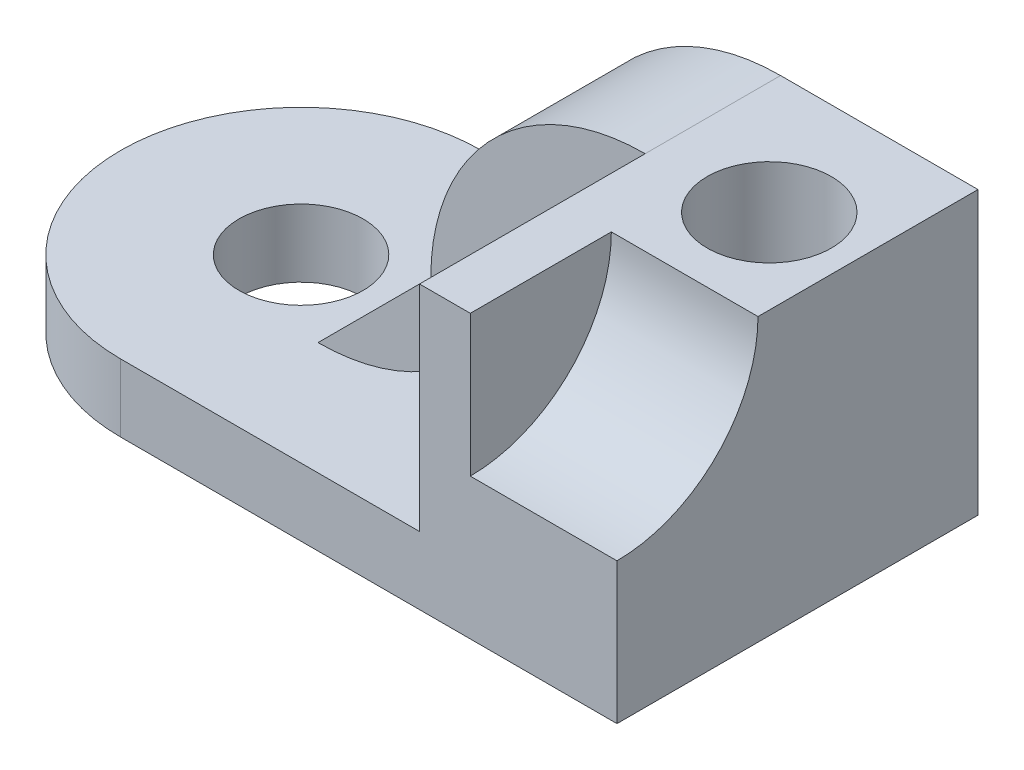
ISO-10303-21;
HEADER;
FILE_DESCRIPTION(('STEP AP214'),'2;1');
FILE_NAME('part.step','',(''),(''),'','','');
FILE_SCHEMA(('AUTOMOTIVE_DESIGN { 1 0 10303 214 1 1 1 1 }'));
ENDSEC;
DATA;
#1=APPLICATION_CONTEXT('core data for automotive mechanical design processes');
#2=APPLICATION_PROTOCOL_DEFINITION('international standard','automotive_design',2000,#1);
#3=PRODUCT_CONTEXT('',#1,'mechanical');
#4=PRODUCT('Part','Part','',(#3));
#5=PRODUCT_RELATED_PRODUCT_CATEGORY('part','',(#4));
#6=PRODUCT_DEFINITION_FORMATION('','',#4);
#7=PRODUCT_DEFINITION_CONTEXT('part definition',#1,'design');
#8=PRODUCT_DEFINITION('design','',#6,#7);
#9=PRODUCT_DEFINITION_SHAPE('','',#8);
#10=(LENGTH_UNIT() NAMED_UNIT(*) SI_UNIT(.MILLI.,.METRE.));
#11=(NAMED_UNIT(*) PLANE_ANGLE_UNIT() SI_UNIT($,.RADIAN.));
#12=(NAMED_UNIT(*) SI_UNIT($,.STERADIAN.) SOLID_ANGLE_UNIT());
#13=UNCERTAINTY_MEASURE_WITH_UNIT(LENGTH_MEASURE(1.E-05),#10,'distance_accuracy_value','');
#14=(GEOMETRIC_REPRESENTATION_CONTEXT(3) GLOBAL_UNCERTAINTY_ASSIGNED_CONTEXT((#13)) GLOBAL_UNIT_ASSIGNED_CONTEXT((#10,
#11,#12)) REPRESENTATION_CONTEXT('',''));
#15=CARTESIAN_POINT('',(0.,0.,0.));
#16=DIRECTION('',(0.,0.,1.));
#17=DIRECTION('',(1.,0.,0.));
#18=AXIS2_PLACEMENT_3D('',#15,#16,#17);
#19=CARTESIAN_POINT('',(47.,50.,12.));
#20=DIRECTION('',(0.,0.,-1.));
#21=DIRECTION('',(-1.,0.,0.));
#22=AXIS2_PLACEMENT_3D('',#19,#20,#21);
#23=CYLINDRICAL_SURFACE('',#22,38.);
#24=CARTESIAN_POINT('',(47.,50.,-32.));
#25=DIRECTION('',(0.,0.,1.));
#26=DIRECTION('',(1.,0.,0.));
#27=AXIS2_PLACEMENT_3D('',#24,#25,#26);
#28=CIRCLE('',#27,38.);
#29=CARTESIAN_POINT('',(47.,12.,-32.));
#30=VERTEX_POINT('',#29);
#31=CARTESIAN_POINT('',(85.,50.,-32.));
#32=VERTEX_POINT('',#31);
#33=EDGE_CURVE('E74',#30,#32,#28,.T.);
#34=ORIENTED_EDGE('',*,*,#33,.T.);
#35=DIRECTION('',(0.,0.,-1.));
#36=VECTOR('',#35,1.);
#37=CARTESIAN_POINT('',(85.,50.,12.));
#38=LINE('',#37,#36);
#39=CARTESIAN_POINT('',(85.,50.,12.));
#40=VERTEX_POINT('',#39);
#41=EDGE_CURVE('E12',#40,#32,#38,.T.);
#42=ORIENTED_EDGE('',*,*,#41,.F.);
#43=CARTESIAN_POINT('',(47.,50.,12.));
#44=DIRECTION('',(0.,0.,1.));
#45=DIRECTION('',(1.,0.,0.));
#46=AXIS2_PLACEMENT_3D('',#43,#44,#45);
#47=CIRCLE('',#46,38.);
#48=CARTESIAN_POINT('',(47.,12.,12.));
#49=VERTEX_POINT('',#48);
#50=EDGE_CURVE('E76',#49,#40,#47,.T.);
#51=ORIENTED_EDGE('',*,*,#50,.F.);
#52=DIRECTION('',(0.,0.,-1.));
#53=VECTOR('',#52,1.);
#54=CARTESIAN_POINT('',(47.,12.,12.));
#55=LINE('',#54,#53);
#56=EDGE_CURVE('E58',#49,#30,#55,.T.);
#57=ORIENTED_EDGE('',*,*,#56,.T.);
#58=EDGE_LOOP('',(#34,#42,#51,#57));
#59=FACE_BOUND('',#58,.T.);
#60=ADVANCED_FACE('F49',(#59),#23,.T.);
#61=CARTESIAN_POINT('',(17.5,-17.5,12.));
#62=DIRECTION('',(-0.707106781186548,0.707106781186548,0.));
#63=DIRECTION('',(-0.707106781186548,-0.707106781186548,0.));
#64=AXIS2_PLACEMENT_3D('',#61,#62,#63);
#65=PLANE('',#64);
#66=DIRECTION('',(0.707106781186548,0.707106781186548,0.));
#67=VECTOR('',#66,1.);
#68=CARTESIAN_POINT('',(17.5,-17.5,-32.));
#69=LINE('',#68,#67);
#70=EDGE_CURVE('E82',#30,#32,#69,.T.);
#71=ORIENTED_EDGE('',*,*,#70,.F.);
#72=ORIENTED_EDGE('',*,*,#56,.F.);
#73=DIRECTION('',(0.707106781186548,0.707106781186548,0.));
#74=VECTOR('',#73,1.);
#75=CARTESIAN_POINT('',(17.5,-17.5,12.));
#76=LINE('',#75,#74);
#77=EDGE_CURVE('E79',#49,#40,#76,.T.);
#78=ORIENTED_EDGE('',*,*,#77,.T.);
#79=ORIENTED_EDGE('',*,*,#41,.T.);
#80=EDGE_LOOP('',(#71,#72,#78,#79));
#81=FACE_BOUND('',#80,.T.);
#82=ADVANCED_FACE('F85',(#81),#65,.T.);
#83=CARTESIAN_POINT('',(47.,50.,12.));
#84=DIRECTION('',(0.,0.,1.));
#85=DIRECTION('',(1.,0.,0.));
#86=AXIS2_PLACEMENT_3D('',#83,#84,#85);
#87=PLANE('',#86);
#88=ORIENTED_EDGE('',*,*,#50,.T.);
#89=ORIENTED_EDGE('',*,*,#77,.F.);
#90=EDGE_LOOP('',(#88,#89));
#91=FACE_BOUND('',#90,.T.);
#92=ADVANCED_FACE('F95',(#91),#87,.T.);
#93=CARTESIAN_POINT('',(47.,50.,-32.));
#94=DIRECTION('',(0.,0.,1.));
#95=DIRECTION('',(1.,0.,0.));
#96=AXIS2_PLACEMENT_3D('',#93,#94,#95);
#97=PLANE('',#96);
#98=ORIENTED_EDGE('',*,*,#33,.F.);
#99=ORIENTED_EDGE('',*,*,#70,.T.);
#100=EDGE_LOOP('',(#98,#99));
#101=FACE_BOUND('',#100,.T.);
#102=ADVANCED_FACE('F81',(#101),#97,.F.);
#103=CLOSED_SHELL('',(#60,#82,#92,#102));
#104=MANIFOLD_SOLID_BREP('B2',#103);
#105=CARTESIAN_POINT('',(85.,12.,-8.));
#106=DIRECTION('',(0.,0.,-1.));
#107=DIRECTION('',(-1.,0.,0.));
#108=AXIS2_PLACEMENT_3D('',#105,#106,#107);
#109=CYLINDRICAL_SURFACE('',#108,38.);
#110=CARTESIAN_POINT('',(85.,12.,-32.));
#111=DIRECTION('',(0.,0.,1.));
#112=DIRECTION('',(1.,0.,0.));
#113=AXIS2_PLACEMENT_3D('',#110,#111,#112);
#114=CIRCLE('',#113,38.);
#115=CARTESIAN_POINT('',(85.,50.,-32.));
#116=VERTEX_POINT('',#115);
#117=CARTESIAN_POINT('',(47.,12.,-32.));
#118=VERTEX_POINT('',#117);
#119=EDGE_CURVE('E182',#116,#118,#114,.T.);
#120=ORIENTED_EDGE('',*,*,#119,.T.);
#121=DIRECTION('',(0.,0.,-1.));
#122=VECTOR('',#121,1.);
#123=CARTESIAN_POINT('',(47.,12.,-8.));
#124=LINE('',#123,#122);
#125=CARTESIAN_POINT('',(47.,12.,-8.));
#126=VERTEX_POINT('',#125);
#127=EDGE_CURVE('E47',#126,#118,#124,.T.);
#128=ORIENTED_EDGE('',*,*,#127,.F.);
#129=CARTESIAN_POINT('',(85.,12.,-8.));
#130=DIRECTION('',(0.,0.,1.));
#131=DIRECTION('',(1.,0.,0.));
#132=AXIS2_PLACEMENT_3D('',#129,#130,#131);
#133=CIRCLE('',#132,38.);
#134=CARTESIAN_POINT('',(85.,50.,-8.));
#135=VERTEX_POINT('',#134);
#136=EDGE_CURVE('E181',#135,#126,#133,.T.);
#137=ORIENTED_EDGE('',*,*,#136,.F.);
#138=DIRECTION('',(0.,0.,-1.));
#139=VECTOR('',#138,1.);
#140=CARTESIAN_POINT('',(85.,50.,-8.));
#141=LINE('',#140,#139);
#142=EDGE_CURVE('E158',#135,#116,#141,.T.);
#143=ORIENTED_EDGE('',*,*,#142,.T.);
#144=EDGE_LOOP('',(#120,#128,#137,#143));
#145=FACE_BOUND('',#144,.T.);
#146=ADVANCED_FACE('F149',(#145),#109,.T.);
#147=CARTESIAN_POINT('',(17.5,-17.5,-8.));
#148=DIRECTION('',(-0.707106781186547,0.707106781186547,0.));
#149=DIRECTION('',(-0.707106781186548,-0.707106781186548,0.));
#150=AXIS2_PLACEMENT_3D('',#147,#148,#149);
#151=PLANE('',#150);
#152=DIRECTION('',(0.707106781186548,0.707106781186548,0.));
#153=VECTOR('',#152,1.);
#154=CARTESIAN_POINT('',(17.5,-17.5,-32.));
#155=LINE('',#154,#153);
#156=EDGE_CURVE('E173',#118,#116,#155,.T.);
#157=ORIENTED_EDGE('',*,*,#156,.T.);
#158=ORIENTED_EDGE('',*,*,#142,.F.);
#159=DIRECTION('',(0.707106781186548,0.707106781186548,0.));
#160=VECTOR('',#159,1.);
#161=CARTESIAN_POINT('',(17.5,-17.5,-8.));
#162=LINE('',#161,#160);
#163=EDGE_CURVE('E165',#126,#135,#162,.T.);
#164=ORIENTED_EDGE('',*,*,#163,.F.);
#165=ORIENTED_EDGE('',*,*,#127,.T.);
#166=EDGE_LOOP('',(#157,#158,#164,#165));
#167=FACE_BOUND('',#166,.T.);
#168=ADVANCED_FACE('F176',(#167),#151,.F.);
#169=CARTESIAN_POINT('',(85.,12.,-8.));
#170=DIRECTION('',(0.,0.,1.));
#171=DIRECTION('',(1.,0.,0.));
#172=AXIS2_PLACEMENT_3D('',#169,#170,#171);
#173=PLANE('',#172);
#174=ORIENTED_EDGE('',*,*,#136,.T.);
#175=ORIENTED_EDGE('',*,*,#163,.T.);
#176=EDGE_LOOP('',(#174,#175));
#177=FACE_BOUND('',#176,.T.);
#178=ADVANCED_FACE('F195',(#177),#173,.T.);
#179=CARTESIAN_POINT('',(85.,12.,-32.));
#180=DIRECTION('',(0.,0.,1.));
#181=DIRECTION('',(1.,0.,0.));
#182=AXIS2_PLACEMENT_3D('',#179,#180,#181);
#183=PLANE('',#182);
#184=ORIENTED_EDGE('',*,*,#119,.F.);
#185=ORIENTED_EDGE('',*,*,#156,.F.);
#186=EDGE_LOOP('',(#184,#185));
#187=FACE_BOUND('',#186,.T.);
#188=ADVANCED_FACE('F186',(#187),#183,.F.);
#189=CLOSED_SHELL('',(#146,#168,#178,#188));
#190=MANIFOLD_SOLID_BREP('B6',#189);
#191=CARTESIAN_POINT('',(120.,0.,32.));
#192=DIRECTION('',(-1.,0.,0.));
#193=DIRECTION('',(0.,0.,1.));
#194=AXIS2_PLACEMENT_3D('',#191,#192,#193);
#195=PLANE('',#194);
#196=DIRECTION('',(0.,0.,-1.));
#197=VECTOR('',#196,1.);
#198=CARTESIAN_POINT('',(120.,50.,32.));
#199=LINE('',#198,#197);
#200=CARTESIAN_POINT('',(120.,50.,7.));
#201=VERTEX_POINT('',#200);
#202=CARTESIAN_POINT('',(120.,50.,-32.));
#203=VERTEX_POINT('',#202);
#204=EDGE_CURVE('E328',#201,#203,#199,.T.);
#205=ORIENTED_EDGE('',*,*,#204,.F.);
#206=CARTESIAN_POINT('',(120.,50.,32.));
#207=DIRECTION('',(1.,0.,0.));
#208=DIRECTION('',(0.,0.,-1.));
#209=AXIS2_PLACEMENT_3D('',#206,#207,#208);
#210=CIRCLE('',#209,25.);
#211=CARTESIAN_POINT('',(120.,25.,32.));
#212=VERTEX_POINT('',#211);
#213=EDGE_CURVE('E308',#212,#201,#210,.T.);
#214=ORIENTED_EDGE('',*,*,#213,.F.);
#215=DIRECTION('',(0.,1.,0.));
#216=VECTOR('',#215,1.);
#217=CARTESIAN_POINT('',(120.,0.,32.));
#218=LINE('',#217,#216);
#219=CARTESIAN_POINT('',(120.,0.,32.));
#220=VERTEX_POINT('',#219);
#221=EDGE_CURVE('E410',#220,#212,#218,.T.);
#222=ORIENTED_EDGE('',*,*,#221,.F.);
#223=DIRECTION('',(0.,0.,-1.));
#224=VECTOR('',#223,1.);
#225=CARTESIAN_POINT('',(120.,0.,32.));
#226=LINE('',#225,#224);
#227=CARTESIAN_POINT('',(120.,0.,-32.));
#228=VERTEX_POINT('',#227);
#229=EDGE_CURVE('E385',#220,#228,#226,.T.);
#230=ORIENTED_EDGE('',*,*,#229,.T.);
#231=DIRECTION('',(0.,1.,0.));
#232=VECTOR('',#231,1.);
#233=CARTESIAN_POINT('',(120.,0.,-32.));
#234=LINE('',#233,#232);
#235=EDGE_CURVE('E333',#228,#203,#234,.T.);
#236=ORIENTED_EDGE('',*,*,#235,.T.);
#237=EDGE_LOOP('',(#205,#214,#222,#230,#236));
#238=FACE_BOUND('',#237,.T.);
#239=ADVANCED_FACE('F240',(#238),#195,.F.);
#240=CARTESIAN_POINT('',(0.,50.,32.));
#241=DIRECTION('',(0.,-1.,0.));
#242=DIRECTION('',(1.,0.,0.));
#243=AXIS2_PLACEMENT_3D('',#240,#241,#242);
#244=PLANE('',#243);
#245=CARTESIAN_POINT('',(105.,50.,-10.));
#246=DIRECTION('',(0.,1.,0.));
#247=DIRECTION('',(-1.,0.,0.));
#248=AXIS2_PLACEMENT_3D('',#245,#246,#247);
#249=CIRCLE('',#248,11.);
#250=CARTESIAN_POINT('',(94.,50.,-10.));
#251=VERTEX_POINT('',#250);
#252=EDGE_CURVE('E440',#251,#251,#249,.T.);
#253=ORIENTED_EDGE('',*,*,#252,.F.);
#254=EDGE_LOOP('',(#253));
#255=FACE_BOUND('',#254,.T.);
#256=DIRECTION('',(0.,0.,1.));
#257=VECTOR('',#256,1.);
#258=CARTESIAN_POINT('',(94.,50.,32.));
#259=LINE('',#258,#257);
#260=CARTESIAN_POINT('',(94.,50.,7.));
#261=VERTEX_POINT('',#260);
#262=CARTESIAN_POINT('',(94.,50.,32.));
#263=VERTEX_POINT('',#262);
#264=EDGE_CURVE('E331',#261,#263,#259,.T.);
#265=ORIENTED_EDGE('',*,*,#264,.F.);
#266=DIRECTION('',(1.,0.,0.));
#267=VECTOR('',#266,1.);
#268=CARTESIAN_POINT('',(94.,50.,7.));
#269=LINE('',#268,#267);
#270=EDGE_CURVE('E312',#261,#201,#269,.T.);
#271=ORIENTED_EDGE('',*,*,#270,.T.);
#272=ORIENTED_EDGE('',*,*,#204,.T.);
#273=DIRECTION('',(-1.,0.,0.));
#274=VECTOR('',#273,1.);
#275=CARTESIAN_POINT('',(0.,50.,-32.));
#276=LINE('',#275,#274);
#277=CARTESIAN_POINT('',(85.,50.,-32.));
#278=VERTEX_POINT('',#277);
#279=EDGE_CURVE('E398',#203,#278,#276,.T.);
#280=ORIENTED_EDGE('',*,*,#279,.T.);
#281=DIRECTION('',(0.,0.,-1.));
#282=VECTOR('',#281,1.);
#283=CARTESIAN_POINT('',(85.,50.,32.));
#284=LINE('',#283,#282);
#285=CARTESIAN_POINT('',(85.,50.,32.));
#286=VERTEX_POINT('',#285);
#287=EDGE_CURVE('E340',#286,#278,#284,.T.);
#288=ORIENTED_EDGE('',*,*,#287,.F.);
#289=DIRECTION('',(-1.,0.,0.));
#290=VECTOR('',#289,1.);
#291=CARTESIAN_POINT('',(0.,50.,32.));
#292=LINE('',#291,#290);
#293=EDGE_CURVE('E458',#263,#286,#292,.T.);
#294=ORIENTED_EDGE('',*,*,#293,.F.);
#295=EDGE_LOOP('',(#265,#271,#272,#280,#288,#294));
#296=FACE_BOUND('',#295,.T.);
#297=ADVANCED_FACE('F326',(#255,#296),#244,.F.);
#298=CARTESIAN_POINT('',(85.,0.,32.));
#299=DIRECTION('',(-1.,0.,0.));
#300=DIRECTION('',(0.,0.,1.));
#301=AXIS2_PLACEMENT_3D('',#298,#299,#300);
#302=PLANE('',#301);
#303=DIRECTION('',(0.,1.,0.));
#304=VECTOR('',#303,1.);
#305=CARTESIAN_POINT('',(85.,0.,-32.));
#306=LINE('',#305,#304);
#307=CARTESIAN_POINT('',(85.,12.,-32.));
#308=VERTEX_POINT('',#307);
#309=EDGE_CURVE('E401',#308,#278,#306,.T.);
#310=ORIENTED_EDGE('',*,*,#309,.F.);
#311=DIRECTION('',(0.,0.,-1.));
#312=VECTOR('',#311,1.);
#313=CARTESIAN_POINT('',(85.,12.,32.));
#314=LINE('',#313,#312);
#315=CARTESIAN_POINT('',(85.,12.,32.));
#316=VERTEX_POINT('',#315);
#317=EDGE_CURVE('E347',#316,#308,#314,.T.);
#318=ORIENTED_EDGE('',*,*,#317,.F.);
#319=DIRECTION('',(0.,1.,0.));
#320=VECTOR('',#319,1.);
#321=CARTESIAN_POINT('',(85.,0.,32.));
#322=LINE('',#321,#320);
#323=EDGE_CURVE('E392',#316,#286,#322,.T.);
#324=ORIENTED_EDGE('',*,*,#323,.T.);
#325=ORIENTED_EDGE('',*,*,#287,.T.);
#326=EDGE_LOOP('',(#310,#318,#324,#325));
#327=FACE_BOUND('',#326,.T.);
#328=ADVANCED_FACE('F422',(#327),#302,.T.);
#329=CARTESIAN_POINT('',(0.,12.,32.));
#330=DIRECTION('',(0.,1.,0.));
#331=DIRECTION('',(-1.,0.,0.));
#332=AXIS2_PLACEMENT_3D('',#329,#330,#331);
#333=PLANE('',#332);
#334=CARTESIAN_POINT('',(32.,12.,0.));
#335=DIRECTION('',(0.,1.,0.));
#336=DIRECTION('',(-1.,0.,0.));
#337=AXIS2_PLACEMENT_3D('',#334,#335,#336);
#338=CIRCLE('',#337,11.);
#339=CARTESIAN_POINT('',(21.,12.,0.));
#340=VERTEX_POINT('',#339);
#341=EDGE_CURVE('E432',#340,#340,#338,.T.);
#342=ORIENTED_EDGE('',*,*,#341,.F.);
#343=EDGE_LOOP('',(#342));
#344=FACE_BOUND('',#343,.T.);
#345=CARTESIAN_POINT('',(32.,12.,0.));
#346=DIRECTION('',(0.,1.,0.));
#347=DIRECTION('',(-1.,0.,0.));
#348=AXIS2_PLACEMENT_3D('',#345,#346,#347);
#349=CIRCLE('',#348,32.);
#350=CARTESIAN_POINT('',(32.,12.,-32.));
#351=VERTEX_POINT('',#350);
#352=CARTESIAN_POINT('',(0.,12.,0.));
#353=VERTEX_POINT('',#352);
#354=EDGE_CURVE('E353',#351,#353,#349,.T.);
#355=ORIENTED_EDGE('',*,*,#354,.T.);
#356=CARTESIAN_POINT('',(32.,12.,0.));
#357=DIRECTION('',(0.,1.,0.));
#358=DIRECTION('',(-1.,0.,0.));
#359=AXIS2_PLACEMENT_3D('',#356,#357,#358);
#360=CIRCLE('',#359,32.);
#361=CARTESIAN_POINT('',(32.,12.,32.));
#362=VERTEX_POINT('',#361);
#363=EDGE_CURVE('E356',#353,#362,#360,.T.);
#364=ORIENTED_EDGE('',*,*,#363,.T.);
#365=DIRECTION('',(1.,0.,0.));
#366=VECTOR('',#365,1.);
#367=CARTESIAN_POINT('',(0.,12.,32.));
#368=LINE('',#367,#366);
#369=EDGE_CURVE('E381',#362,#316,#368,.T.);
#370=ORIENTED_EDGE('',*,*,#369,.T.);
#371=ORIENTED_EDGE('',*,*,#317,.T.);
#372=DIRECTION('',(1.,0.,0.));
#373=VECTOR('',#372,1.);
#374=CARTESIAN_POINT('',(0.,12.,-32.));
#375=LINE('',#374,#373);
#376=EDGE_CURVE('E405',#351,#308,#375,.T.);
#377=ORIENTED_EDGE('',*,*,#376,.F.);
#378=EDGE_LOOP('',(#355,#364,#370,#371,#377));
#379=FACE_BOUND('',#378,.T.);
#380=ADVANCED_FACE('F418',(#344,#379),#333,.T.);
#381=CARTESIAN_POINT('',(0.,0.,32.));
#382=DIRECTION('',(0.,1.,0.));
#383=DIRECTION('',(0.,0.,1.));
#384=AXIS2_PLACEMENT_3D('',#381,#382,#383);
#385=PLANE('',#384);
#386=CARTESIAN_POINT('',(105.,0.,-10.));
#387=DIRECTION('',(0.,1.,0.));
#388=DIRECTION('',(-1.,0.,0.));
#389=AXIS2_PLACEMENT_3D('',#386,#387,#388);
#390=CIRCLE('',#389,11.);
#391=CARTESIAN_POINT('',(94.,0.,-10.));
#392=VERTEX_POINT('',#391);
#393=EDGE_CURVE('E433',#392,#392,#390,.T.);
#394=ORIENTED_EDGE('',*,*,#393,.T.);
#395=EDGE_LOOP('',(#394));
#396=FACE_BOUND('',#395,.T.);
#397=CARTESIAN_POINT('',(32.,0.,0.));
#398=DIRECTION('',(0.,1.,0.));
#399=DIRECTION('',(-1.,0.,0.));
#400=AXIS2_PLACEMENT_3D('',#397,#398,#399);
#401=CIRCLE('',#400,11.);
#402=CARTESIAN_POINT('',(21.,0.,0.));
#403=VERTEX_POINT('',#402);
#404=EDGE_CURVE('E322',#403,#403,#401,.T.);
#405=ORIENTED_EDGE('',*,*,#404,.T.);
#406=EDGE_LOOP('',(#405));
#407=FACE_BOUND('',#406,.T.);
#408=DIRECTION('',(1.,0.,0.));
#409=VECTOR('',#408,1.);
#410=CARTESIAN_POINT('',(0.,0.,32.));
#411=LINE('',#410,#409);
#412=CARTESIAN_POINT('',(32.,0.,32.));
#413=VERTEX_POINT('',#412);
#414=EDGE_CURVE('E378',#413,#220,#411,.T.);
#415=ORIENTED_EDGE('',*,*,#414,.F.);
#416=CARTESIAN_POINT('',(32.,0.,0.));
#417=DIRECTION('',(0.,1.,0.));
#418=DIRECTION('',(0.,0.,1.));
#419=AXIS2_PLACEMENT_3D('',#416,#417,#418);
#420=CIRCLE('',#419,32.);
#421=CARTESIAN_POINT('',(0.,0.,0.));
#422=VERTEX_POINT('',#421);
#423=EDGE_CURVE('E250',#413,#422,#420,.F.);
#424=ORIENTED_EDGE('',*,*,#423,.T.);
#425=CARTESIAN_POINT('',(32.,0.,0.));
#426=DIRECTION('',(0.,1.,0.));
#427=DIRECTION('',(0.,0.,1.));
#428=AXIS2_PLACEMENT_3D('',#425,#426,#427);
#429=CIRCLE('',#428,32.);
#430=CARTESIAN_POINT('',(32.,0.,-32.));
#431=VERTEX_POINT('',#430);
#432=EDGE_CURVE('E260',#422,#431,#429,.F.);
#433=ORIENTED_EDGE('',*,*,#432,.T.);
#434=DIRECTION('',(1.,0.,0.));
#435=VECTOR('',#434,1.);
#436=CARTESIAN_POINT('',(0.,0.,-32.));
#437=LINE('',#436,#435);
#438=EDGE_CURVE('E408',#431,#228,#437,.T.);
#439=ORIENTED_EDGE('',*,*,#438,.T.);
#440=ORIENTED_EDGE('',*,*,#229,.F.);
#441=EDGE_LOOP('',(#415,#424,#433,#439,#440));
#442=FACE_BOUND('',#441,.T.);
#443=ADVANCED_FACE('F384',(#396,#407,#442),#385,.F.);
#444=CARTESIAN_POINT('',(0.,0.,32.));
#445=DIRECTION('',(0.,0.,1.));
#446=DIRECTION('',(1.,0.,0.));
#447=AXIS2_PLACEMENT_3D('',#444,#445,#446);
#448=PLANE('',#447);
#449=ORIENTED_EDGE('',*,*,#369,.F.);
#450=DIRECTION('',(0.,1.,0.));
#451=VECTOR('',#450,1.);
#452=CARTESIAN_POINT('',(32.,0.,32.));
#453=LINE('',#452,#451);
#454=EDGE_CURVE('E359',#362,#413,#453,.F.);
#455=ORIENTED_EDGE('',*,*,#454,.T.);
#456=ORIENTED_EDGE('',*,*,#414,.T.);
#457=ORIENTED_EDGE('',*,*,#221,.T.);
#458=DIRECTION('',(1.,0.,0.));
#459=VECTOR('',#458,1.);
#460=CARTESIAN_POINT('',(94.,25.,32.));
#461=LINE('',#460,#459);
#462=CARTESIAN_POINT('',(94.,25.,32.));
#463=VERTEX_POINT('',#462);
#464=EDGE_CURVE('E315',#463,#212,#461,.T.);
#465=ORIENTED_EDGE('',*,*,#464,.F.);
#466=DIRECTION('',(0.,1.,0.));
#467=VECTOR('',#466,1.);
#468=CARTESIAN_POINT('',(94.,0.,32.));
#469=LINE('',#468,#467);
#470=EDGE_CURVE('E339',#463,#263,#469,.T.);
#471=ORIENTED_EDGE('',*,*,#470,.T.);
#472=ORIENTED_EDGE('',*,*,#293,.T.);
#473=ORIENTED_EDGE('',*,*,#323,.F.);
#474=EDGE_LOOP('',(#449,#455,#456,#457,#465,#471,#472,#473));
#475=FACE_BOUND('',#474,.T.);
#476=ADVANCED_FACE('F377',(#475),#448,.T.);
#477=CARTESIAN_POINT('',(0.,0.,-32.));
#478=DIRECTION('',(0.,0.,1.));
#479=DIRECTION('',(1.,0.,0.));
#480=AXIS2_PLACEMENT_3D('',#477,#478,#479);
#481=PLANE('',#480);
#482=ORIENTED_EDGE('',*,*,#438,.F.);
#483=DIRECTION('',(0.,1.,0.));
#484=VECTOR('',#483,1.);
#485=CARTESIAN_POINT('',(32.,12.,-32.));
#486=LINE('',#485,#484);
#487=EDGE_CURVE('E147',#431,#351,#486,.T.);
#488=ORIENTED_EDGE('',*,*,#487,.T.);
#489=ORIENTED_EDGE('',*,*,#376,.T.);
#490=ORIENTED_EDGE('',*,*,#309,.T.);
#491=ORIENTED_EDGE('',*,*,#279,.F.);
#492=ORIENTED_EDGE('',*,*,#235,.F.);
#493=EDGE_LOOP('',(#482,#488,#489,#490,#491,#492));
#494=FACE_BOUND('',#493,.T.);
#495=ADVANCED_FACE('F425',(#494),#481,.F.);
#496=CARTESIAN_POINT('',(94.,50.,32.));
#497=DIRECTION('',(1.,0.,0.));
#498=DIRECTION('',(0.,0.,-1.));
#499=AXIS2_PLACEMENT_3D('',#496,#497,#498);
#500=CYLINDRICAL_SURFACE('',#499,25.);
#501=CARTESIAN_POINT('',(94.,50.,32.));
#502=DIRECTION('',(1.,0.,0.));
#503=DIRECTION('',(0.,0.,-1.));
#504=AXIS2_PLACEMENT_3D('',#501,#502,#503);
#505=CIRCLE('',#504,25.);
#506=EDGE_CURVE('E321',#463,#261,#505,.T.);
#507=ORIENTED_EDGE('',*,*,#506,.F.);
#508=ORIENTED_EDGE('',*,*,#464,.T.);
#509=ORIENTED_EDGE('',*,*,#213,.T.);
#510=ORIENTED_EDGE('',*,*,#270,.F.);
#511=EDGE_LOOP('',(#507,#508,#509,#510));
#512=FACE_BOUND('',#511,.T.);
#513=ADVANCED_FACE('F311',(#512),#500,.F.);
#514=CARTESIAN_POINT('',(94.,50.,32.));
#515=DIRECTION('',(1.,0.,0.));
#516=DIRECTION('',(0.,0.,-1.));
#517=AXIS2_PLACEMENT_3D('',#514,#515,#516);
#518=PLANE('',#517);
#519=ORIENTED_EDGE('',*,*,#264,.T.);
#520=ORIENTED_EDGE('',*,*,#470,.F.);
#521=ORIENTED_EDGE('',*,*,#506,.T.);
#522=EDGE_LOOP('',(#519,#520,#521));
#523=FACE_BOUND('',#522,.T.);
#524=ADVANCED_FACE('F463',(#523),#518,.T.);
#525=CARTESIAN_POINT('',(32.,0.,0.));
#526=DIRECTION('',(0.,1.,0.));
#527=DIRECTION('',(-1.,0.,0.));
#528=AXIS2_PLACEMENT_3D('',#525,#526,#527);
#529=CYLINDRICAL_SURFACE('',#528,11.);
#530=ORIENTED_EDGE('',*,*,#404,.F.);
#531=EDGE_LOOP('',(#530));
#532=FACE_BOUND('',#531,.T.);
#533=ORIENTED_EDGE('',*,*,#341,.T.);
#534=EDGE_LOOP('',(#533));
#535=FACE_BOUND('',#534,.T.);
#536=ADVANCED_FACE('F465',(#532,#535),#529,.F.);
#537=CARTESIAN_POINT('',(32.,0.,0.));
#538=DIRECTION('',(0.,-1.,0.));
#539=DIRECTION('',(0.,0.,-1.));
#540=AXIS2_PLACEMENT_3D('',#537,#538,#539);
#541=CYLINDRICAL_SURFACE('',#540,32.);
#542=ORIENTED_EDGE('',*,*,#487,.F.);
#543=ORIENTED_EDGE('',*,*,#432,.F.);
#544=DIRECTION('',(0.,1.,0.));
#545=VECTOR('',#544,1.);
#546=CARTESIAN_POINT('',(0.,0.,0.));
#547=LINE('',#546,#545);
#548=EDGE_CURVE('E244',#353,#422,#547,.F.);
#549=ORIENTED_EDGE('',*,*,#548,.F.);
#550=ORIENTED_EDGE('',*,*,#354,.F.);
#551=EDGE_LOOP('',(#542,#543,#549,#550));
#552=FACE_BOUND('',#551,.T.);
#553=ADVANCED_FACE('F242',(#552),#541,.T.);
#554=CARTESIAN_POINT('',(32.,0.,0.));
#555=DIRECTION('',(0.,1.,0.));
#556=DIRECTION('',(0.,0.,1.));
#557=AXIS2_PLACEMENT_3D('',#554,#555,#556);
#558=CYLINDRICAL_SURFACE('',#557,32.);
#559=ORIENTED_EDGE('',*,*,#423,.F.);
#560=ORIENTED_EDGE('',*,*,#454,.F.);
#561=ORIENTED_EDGE('',*,*,#363,.F.);
#562=ORIENTED_EDGE('',*,*,#548,.T.);
#563=EDGE_LOOP('',(#559,#560,#561,#562));
#564=FACE_BOUND('',#563,.T.);
#565=ADVANCED_FACE('F430',(#564),#558,.T.);
#566=CARTESIAN_POINT('',(105.,0.,-10.));
#567=DIRECTION('',(0.,1.,0.));
#568=DIRECTION('',(-1.,0.,0.));
#569=AXIS2_PLACEMENT_3D('',#566,#567,#568);
#570=CYLINDRICAL_SURFACE('',#569,11.);
#571=CARTESIAN_POINT('',(94.,0.,-10.));
#572=CARTESIAN_POINT('',(94.,0.52083333333331,-10.));
#573=CARTESIAN_POINT('',(94.,1.04166666666664,-10.));
#574=CARTESIAN_POINT('',(94.,2.08333333333331,-10.));
#575=CARTESIAN_POINT('',(94.,2.60416666666664,-10.));
#576=CARTESIAN_POINT('',(94.,3.64583333333331,-10.));
#577=CARTESIAN_POINT('',(94.,4.16666666666664,-10.));
#578=CARTESIAN_POINT('',(94.,5.20833333333331,-10.));
#579=CARTESIAN_POINT('',(94.,5.72916666666665,-10.));
#580=CARTESIAN_POINT('',(94.,6.77083333333331,-10.));
#581=CARTESIAN_POINT('',(94.,7.29166666666665,-10.));
#582=CARTESIAN_POINT('',(94.,8.33333333333331,-10.));
#583=CARTESIAN_POINT('',(94.,8.85416666666665,-10.));
#584=CARTESIAN_POINT('',(94.,9.89583333333331,-10.));
#585=CARTESIAN_POINT('',(94.,10.4166666666666,-10.));
#586=CARTESIAN_POINT('',(94.,11.4583333333333,-10.));
#587=CARTESIAN_POINT('',(94.,11.9791666666667,-10.));
#588=CARTESIAN_POINT('',(94.,13.0208333333333,-10.));
#589=CARTESIAN_POINT('',(94.,13.5416666666667,-10.));
#590=CARTESIAN_POINT('',(94.,14.5833333333333,-10.));
#591=CARTESIAN_POINT('',(94.,15.1041666666667,-10.));
#592=CARTESIAN_POINT('',(94.,16.1458333333333,-10.));
#593=CARTESIAN_POINT('',(94.,16.6666666666667,-10.));
#594=CARTESIAN_POINT('',(94.,17.7083333333333,-10.));
#595=CARTESIAN_POINT('',(94.,18.2291666666667,-10.));
#596=CARTESIAN_POINT('',(94.,19.2708333333333,-10.));
#597=CARTESIAN_POINT('',(94.,19.7916666666667,-10.));
#598=CARTESIAN_POINT('',(94.,20.8333333333333,-10.));
#599=CARTESIAN_POINT('',(94.,21.3541666666667,-10.));
#600=CARTESIAN_POINT('',(94.,22.3958333333333,-10.));
#601=CARTESIAN_POINT('',(94.,22.9166666666667,-10.));
#602=CARTESIAN_POINT('',(94.,23.9583333333333,-10.));
#603=CARTESIAN_POINT('',(94.,24.4791666666667,-10.));
#604=CARTESIAN_POINT('',(94.,25.5208333333333,-10.));
#605=CARTESIAN_POINT('',(94.,26.0416666666667,-10.));
#606=CARTESIAN_POINT('',(94.,27.0833333333333,-10.));
#607=CARTESIAN_POINT('',(94.,27.6041666666667,-10.));
#608=CARTESIAN_POINT('',(94.,28.6458333333333,-10.));
#609=CARTESIAN_POINT('',(94.,29.1666666666667,-10.));
#610=CARTESIAN_POINT('',(94.,30.2083333333333,-10.));
#611=CARTESIAN_POINT('',(94.,30.7291666666667,-10.));
#612=CARTESIAN_POINT('',(94.,31.7708333333333,-10.));
#613=CARTESIAN_POINT('',(94.,32.2916666666667,-10.));
#614=CARTESIAN_POINT('',(94.,33.3333333333333,-10.));
#615=CARTESIAN_POINT('',(94.,33.8541666666667,-10.));
#616=CARTESIAN_POINT('',(94.,34.8958333333333,-10.));
#617=CARTESIAN_POINT('',(94.,35.4166666666667,-10.));
#618=CARTESIAN_POINT('',(94.,36.4583333333333,-10.));
#619=CARTESIAN_POINT('',(94.,36.9791666666667,-10.));
#620=CARTESIAN_POINT('',(94.,38.0208333333333,-10.));
#621=CARTESIAN_POINT('',(94.,38.5416666666667,-10.));
#622=CARTESIAN_POINT('',(94.,39.5833333333333,-10.));
#623=CARTESIAN_POINT('',(94.,40.1041666666667,-10.));
#624=CARTESIAN_POINT('',(94.,41.1458333333333,-10.));
#625=CARTESIAN_POINT('',(94.,41.6666666666667,-10.));
#626=CARTESIAN_POINT('',(94.,42.7083333333333,-10.));
#627=CARTESIAN_POINT('',(94.,43.2291666666667,-10.));
#628=CARTESIAN_POINT('',(94.,44.2708333333333,-10.));
#629=CARTESIAN_POINT('',(94.,44.7916666666667,-10.));
#630=CARTESIAN_POINT('',(94.,45.8333333333333,-10.));
#631=CARTESIAN_POINT('',(94.,46.3541666666667,-10.));
#632=CARTESIAN_POINT('',(94.,47.3958333333333,-10.));
#633=CARTESIAN_POINT('',(94.,47.9166666666667,-10.));
#634=CARTESIAN_POINT('',(94.,48.9583333333333,-10.));
#635=CARTESIAN_POINT('',(94.,49.4791666666667,-10.));
#636=CARTESIAN_POINT('',(94.,50.,-10.));
#637=B_SPLINE_CURVE_WITH_KNOTS('',3,(#571,#572,#573,#574,#575,#576,#577,#578,#579,#580,#581,
#582,#583,#584,#585,#586,#587,#588,#589,#590,#591,#592,#593,#594,#595,#596,#597,#598,#599,#600,
#601,#602,#603,#604,#605,#606,#607,#608,#609,#610,#611,#612,#613,#614,#615,#616,#617,#618,#619,
#620,#621,#622,#623,#624,#625,#626,#627,#628,#629,#630,#631,#632,#633,#634,#635,#636),
.UNSPECIFIED.,.F.,.F.,(4,2,2,2,2,2,2,2,2,2,2,2,2,2,2,2,2,2,2,2,2,2,2,2,2,2,2,2,2,2,2,2,4),(0.,
1.5625,3.125,4.6875,6.25,7.8125,9.37500000000001,10.9375,12.5,14.0625,15.625,17.1875,18.75,
20.3125,21.875,23.4375,25.,26.5625,28.125,29.6875,31.25,32.8125,34.375,35.9375,37.5,39.0625,
40.625,42.1875,43.75,45.3125,46.875,48.4375,50.),.UNSPECIFIED.);
#638=EDGE_CURVE('BSEAM483',#392,#251,#637,.T.);
#639=ORIENTED_EDGE('',*,*,#393,.F.);
#640=ORIENTED_EDGE('',*,*,#252,.T.);
#641=ORIENTED_EDGE('',*,*,#638,.T.);
#642=ORIENTED_EDGE('',*,*,#638,.F.);
#643=EDGE_LOOP('',(#639,#641,#640,#642));
#644=FACE_BOUND('',#643,.T.);
#645=ADVANCED_FACE('F483',(#644),#570,.F.);
#646=CLOSED_SHELL('',(#239,#297,#328,#380,#443,#476,#495,#513,#524,#536,#553,#565,#645));
#647=MANIFOLD_SOLID_BREP('B41',#646);
#648=ADVANCED_BREP_SHAPE_REPRESENTATION('',(#18,#104,#190,#647),#14);
#649=SHAPE_DEFINITION_REPRESENTATION(#9,#648);
ENDSEC;
END-ISO-10303-21;
